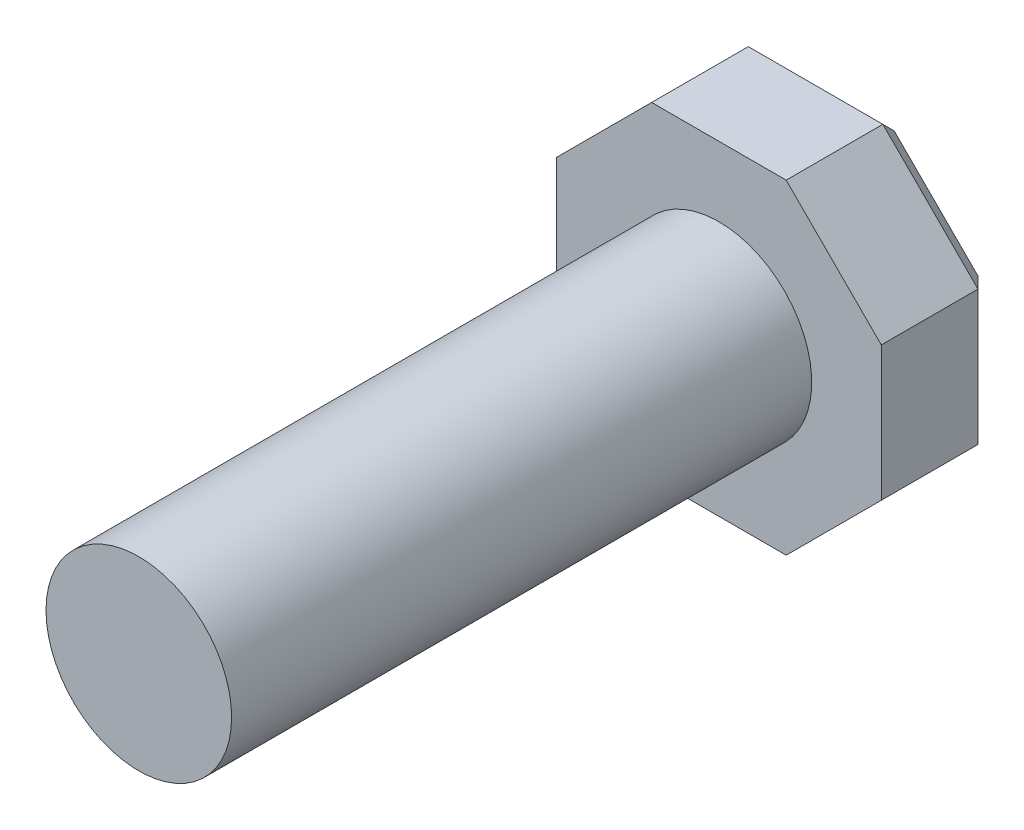
ISO-10303-21;
HEADER;
FILE_DESCRIPTION(('STEP AP214'),'2;1');
FILE_NAME('part.step','',(''),(''),'','','');
FILE_SCHEMA(('AUTOMOTIVE_DESIGN { 1 0 10303 214 1 1 1 1 }'));
ENDSEC;
DATA;
#1=APPLICATION_CONTEXT('core data for automotive mechanical design processes');
#2=APPLICATION_PROTOCOL_DEFINITION('international standard','automotive_design',2000,#1);
#3=PRODUCT_CONTEXT('',#1,'mechanical');
#4=PRODUCT('Part','Part','',(#3));
#5=PRODUCT_RELATED_PRODUCT_CATEGORY('part','',(#4));
#6=PRODUCT_DEFINITION_FORMATION('','',#4);
#7=PRODUCT_DEFINITION_CONTEXT('part definition',#1,'design');
#8=PRODUCT_DEFINITION('design','',#6,#7);
#9=PRODUCT_DEFINITION_SHAPE('','',#8);
#10=(LENGTH_UNIT() NAMED_UNIT(*) SI_UNIT(.MILLI.,.METRE.));
#11=(NAMED_UNIT(*) PLANE_ANGLE_UNIT() SI_UNIT($,.RADIAN.));
#12=(NAMED_UNIT(*) SI_UNIT($,.STERADIAN.) SOLID_ANGLE_UNIT());
#13=UNCERTAINTY_MEASURE_WITH_UNIT(LENGTH_MEASURE(1.E-05),#10,'distance_accuracy_value','');
#14=(GEOMETRIC_REPRESENTATION_CONTEXT(3) GLOBAL_UNCERTAINTY_ASSIGNED_CONTEXT((#13)) GLOBAL_UNIT_ASSIGNED_CONTEXT((#10,
#11,#12)) REPRESENTATION_CONTEXT('',''));
#15=CARTESIAN_POINT('',(0.,0.,0.));
#16=DIRECTION('',(0.,0.,1.));
#17=DIRECTION('',(1.,0.,0.));
#18=AXIS2_PLACEMENT_3D('',#15,#16,#17);
#19=CARTESIAN_POINT('',(21.0000000000007,20.9999999999999,14.9999999999998));
#20=DIRECTION('',(0.,0.,-1.));
#21=DIRECTION('',(-1.,0.,0.));
#22=AXIS2_PLACEMENT_3D('',#19,#20,#21);
#23=PLANE('',#22);
#24=DIRECTION('',(-1.,0.,0.));
#25=VECTOR('',#24,1.);
#26=CARTESIAN_POINT('',(-8.69848480983415,21.,14.9999999999998));
#27=LINE('',#26,#25);
#28=CARTESIAN_POINT('',(8.69848480983559,21.,14.9999999999998));
#29=VERTEX_POINT('',#28);
#30=CARTESIAN_POINT('',(-8.69848480983415,21.,14.9999999999998));
#31=VERTEX_POINT('',#30);
#32=EDGE_CURVE('E138',#29,#31,#27,.T.);
#33=ORIENTED_EDGE('',*,*,#32,.T.);
#34=DIRECTION('',(-0.707106781186544,-0.707106781186551,0.));
#35=VECTOR('',#34,1.);
#36=CARTESIAN_POINT('',(-20.9999999999991,8.69848480983493,15.0000000000002));
#37=LINE('',#36,#35);
#38=CARTESIAN_POINT('',(-20.9999999999991,8.69848480983493,15.0000000000002));
#39=VERTEX_POINT('',#38);
#40=EDGE_CURVE('E126',#31,#39,#37,.T.);
#41=ORIENTED_EDGE('',*,*,#40,.T.);
#42=DIRECTION('',(0.,-1.,0.));
#43=VECTOR('',#42,1.);
#44=CARTESIAN_POINT('',(-20.9999999999991,-8.69848480983509,15.0000000000002));
#45=LINE('',#44,#43);
#46=CARTESIAN_POINT('',(-20.9999999999991,-8.69848480983509,15.0000000000002));
#47=VERTEX_POINT('',#46);
#48=EDGE_CURVE('E137',#39,#47,#45,.T.);
#49=ORIENTED_EDGE('',*,*,#48,.T.);
#50=DIRECTION('',(0.707106781186549,-0.707106781186546,0.));
#51=VECTOR('',#50,1.);
#52=CARTESIAN_POINT('',(-8.69848480983504,-21.0000000000001,15.0000000000002));
#53=LINE('',#52,#51);
#54=CARTESIAN_POINT('',(-8.69848480983504,-21.0000000000001,15.0000000000002));
#55=VERTEX_POINT('',#54);
#56=EDGE_CURVE('E237',#47,#55,#53,.T.);
#57=ORIENTED_EDGE('',*,*,#56,.T.);
#58=DIRECTION('',(1.,0.,0.));
#59=VECTOR('',#58,1.);
#60=CARTESIAN_POINT('',(8.69848480983504,-21.,15.0000000000002));
#61=LINE('',#60,#59);
#62=CARTESIAN_POINT('',(8.69848480983504,-21.,15.0000000000002));
#63=VERTEX_POINT('',#62);
#64=EDGE_CURVE('E239',#55,#63,#61,.T.);
#65=ORIENTED_EDGE('',*,*,#64,.T.);
#66=DIRECTION('',(0.707106781186544,0.707106781186551,0.));
#67=VECTOR('',#66,1.);
#68=CARTESIAN_POINT('',(21.0000000000007,-8.69848480983496,14.9999999999998));
#69=LINE('',#68,#67);
#70=CARTESIAN_POINT('',(21.0000000000007,-8.69848480983496,14.9999999999998));
#71=VERTEX_POINT('',#70);
#72=EDGE_CURVE('E243',#63,#71,#69,.T.);
#73=ORIENTED_EDGE('',*,*,#72,.T.);
#74=DIRECTION('',(0.,1.,0.));
#75=VECTOR('',#74,1.);
#76=CARTESIAN_POINT('',(21.,8.69848480983507,14.9999999999998));
#77=LINE('',#76,#75);
#78=CARTESIAN_POINT('',(21.,8.69848480983507,14.9999999999998));
#79=VERTEX_POINT('',#78);
#80=EDGE_CURVE('E196',#71,#79,#77,.T.);
#81=ORIENTED_EDGE('',*,*,#80,.T.);
#82=DIRECTION('',(-0.707106781186548,0.707106781186546,0.));
#83=VECTOR('',#82,1.);
#84=CARTESIAN_POINT('',(8.69848480983559,21.,14.9999999999998));
#85=LINE('',#84,#83);
#86=EDGE_CURVE('E143',#79,#29,#85,.T.);
#87=ORIENTED_EDGE('',*,*,#86,.T.);
#88=EDGE_LOOP('',(#33,#41,#49,#57,#65,#73,#81,#87));
#89=FACE_BOUND('',#88,.T.);
#90=CARTESIAN_POINT('',(0.,0.,15.));
#91=DIRECTION('',(0.,0.,-1.));
#92=DIRECTION('',(-1.,0.,0.));
#93=AXIS2_PLACEMENT_3D('',#90,#91,#92);
#94=CIRCLE('',#93,12.);
#95=CARTESIAN_POINT('',(-12.,0.,15.));
#96=VERTEX_POINT('',#95);
#97=EDGE_CURVE('E11',#96,#96,#94,.F.);
#98=ORIENTED_EDGE('',*,*,#97,.F.);
#99=EDGE_LOOP('',(#98));
#100=FACE_BOUND('',#99,.T.);
#101=ADVANCED_FACE('F34',(#89,#100),#23,.F.);
#102=CARTESIAN_POINT('',(-8.69848480983415,21.,14.9999999999998));
#103=DIRECTION('',(0.,-1.,0.));
#104=DIRECTION('',(1.,0.,0.));
#105=AXIS2_PLACEMENT_3D('',#102,#103,#104);
#106=PLANE('',#105);
#107=DIRECTION('',(0.,0.,-1.));
#108=VECTOR('',#107,1.);
#109=CARTESIAN_POINT('',(8.69848480983559,21.,14.9999999999998));
#110=LINE('',#109,#108);
#111=CARTESIAN_POINT('',(8.69848480983504,21.,2.49999999999984));
#112=VERTEX_POINT('',#111);
#113=EDGE_CURVE('E247',#29,#112,#110,.T.);
#114=ORIENTED_EDGE('',*,*,#113,.T.);
#115=DIRECTION('',(-1.,0.,0.));
#116=VECTOR('',#115,1.);
#117=CARTESIAN_POINT('',(-8.69848480983415,21.,2.49999999999984));
#118=LINE('',#117,#116);
#119=CARTESIAN_POINT('',(-8.69848480983415,21.,2.49999999999984));
#120=VERTEX_POINT('',#119);
#121=EDGE_CURVE('E42',#112,#120,#118,.T.);
#122=ORIENTED_EDGE('',*,*,#121,.T.);
#123=DIRECTION('',(0.,0.,-1.));
#124=VECTOR('',#123,1.);
#125=CARTESIAN_POINT('',(-8.69848480983415,21.,14.9999999999998));
#126=LINE('',#125,#124);
#127=EDGE_CURVE('E131',#31,#120,#126,.T.);
#128=ORIENTED_EDGE('',*,*,#127,.F.);
#129=ORIENTED_EDGE('',*,*,#32,.F.);
#130=EDGE_LOOP('',(#114,#122,#128,#129));
#131=FACE_BOUND('',#130,.T.);
#132=ADVANCED_FACE('F36',(#131),#106,.F.);
#133=CARTESIAN_POINT('',(-20.9999999999991,8.69848480983493,15.0000000000002));
#134=DIRECTION('',(0.707106781186551,-0.707106781186544,0.));
#135=DIRECTION('',(0.707106781186544,0.707106781186551,0.));
#136=AXIS2_PLACEMENT_3D('',#133,#134,#135);
#137=PLANE('',#136);
#138=ORIENTED_EDGE('',*,*,#127,.T.);
#139=DIRECTION('',(-0.707106781186544,-0.707106781186551,0.));
#140=VECTOR('',#139,1.);
#141=CARTESIAN_POINT('',(-20.9999999999991,8.69848480983515,2.50000000000022));
#142=LINE('',#141,#140);
#143=CARTESIAN_POINT('',(-20.9999999999991,8.69848480983515,2.50000000000022));
#144=VERTEX_POINT('',#143);
#145=EDGE_CURVE('E148',#120,#144,#142,.T.);
#146=ORIENTED_EDGE('',*,*,#145,.T.);
#147=DIRECTION('',(0.,0.,-1.));
#148=VECTOR('',#147,1.);
#149=CARTESIAN_POINT('',(-20.9999999999991,8.69848480983493,15.0000000000002));
#150=LINE('',#149,#148);
#151=EDGE_CURVE('E134',#39,#144,#150,.T.);
#152=ORIENTED_EDGE('',*,*,#151,.F.);
#153=ORIENTED_EDGE('',*,*,#40,.F.);
#154=EDGE_LOOP('',(#138,#146,#152,#153));
#155=FACE_BOUND('',#154,.T.);
#156=ADVANCED_FACE('F128',(#155),#137,.F.);
#157=CARTESIAN_POINT('',(-20.9999999999991,-8.69848480983509,15.0000000000002));
#158=DIRECTION('',(1.,0.,0.));
#159=DIRECTION('',(0.,0.,-1.));
#160=AXIS2_PLACEMENT_3D('',#157,#158,#159);
#161=PLANE('',#160);
#162=ORIENTED_EDGE('',*,*,#151,.T.);
#163=DIRECTION('',(0.,-1.,0.));
#164=VECTOR('',#163,1.);
#165=CARTESIAN_POINT('',(-21.0000000000001,-8.69848480983487,2.50000000000022));
#166=LINE('',#165,#164);
#167=CARTESIAN_POINT('',(-21.0000000000001,-8.69848480983487,2.50000000000022));
#168=VERTEX_POINT('',#167);
#169=EDGE_CURVE('E172',#144,#168,#166,.T.);
#170=ORIENTED_EDGE('',*,*,#169,.T.);
#171=DIRECTION('',(0.,0.,-1.));
#172=VECTOR('',#171,1.);
#173=CARTESIAN_POINT('',(-20.9999999999991,-8.69848480983509,15.0000000000002));
#174=LINE('',#173,#172);
#175=EDGE_CURVE('E152',#47,#168,#174,.T.);
#176=ORIENTED_EDGE('',*,*,#175,.F.);
#177=ORIENTED_EDGE('',*,*,#48,.F.);
#178=EDGE_LOOP('',(#162,#170,#176,#177));
#179=FACE_BOUND('',#178,.T.);
#180=ADVANCED_FACE('F233',(#179),#161,.F.);
#181=CARTESIAN_POINT('',(-8.69848480983504,-21.0000000000001,15.0000000000002));
#182=DIRECTION('',(0.707106781186546,0.707106781186549,0.));
#183=DIRECTION('',(-0.707106781186549,0.707106781186546,0.));
#184=AXIS2_PLACEMENT_3D('',#181,#182,#183);
#185=PLANE('',#184);
#186=ORIENTED_EDGE('',*,*,#175,.T.);
#187=DIRECTION('',(0.707106781186549,-0.707106781186546,0.));
#188=VECTOR('',#187,1.);
#189=CARTESIAN_POINT('',(-8.69848480983526,-21.0000000000001,2.50000000000022));
#190=LINE('',#189,#188);
#191=CARTESIAN_POINT('',(-8.69848480983526,-21.0000000000001,2.50000000000022));
#192=VERTEX_POINT('',#191);
#193=EDGE_CURVE('E174',#168,#192,#190,.T.);
#194=ORIENTED_EDGE('',*,*,#193,.T.);
#195=DIRECTION('',(0.,0.,-1.));
#196=VECTOR('',#195,1.);
#197=CARTESIAN_POINT('',(-8.69848480983504,-21.0000000000001,15.0000000000002));
#198=LINE('',#197,#196);
#199=EDGE_CURVE('E251',#55,#192,#198,.T.);
#200=ORIENTED_EDGE('',*,*,#199,.F.);
#201=ORIENTED_EDGE('',*,*,#56,.F.);
#202=EDGE_LOOP('',(#186,#194,#200,#201));
#203=FACE_BOUND('',#202,.T.);
#204=ADVANCED_FACE('F255',(#203),#185,.F.);
#205=CARTESIAN_POINT('',(8.69848480983504,-21.,15.0000000000002));
#206=DIRECTION('',(0.,1.,0.));
#207=DIRECTION('',(-1.,0.,0.));
#208=AXIS2_PLACEMENT_3D('',#205,#206,#207);
#209=PLANE('',#208);
#210=ORIENTED_EDGE('',*,*,#199,.T.);
#211=DIRECTION('',(1.,0.,0.));
#212=VECTOR('',#211,1.);
#213=CARTESIAN_POINT('',(8.69848480983504,-21.,2.50000000000022));
#214=LINE('',#213,#212);
#215=CARTESIAN_POINT('',(8.69848480983504,-21.,2.50000000000022));
#216=VERTEX_POINT('',#215);
#217=EDGE_CURVE('E176',#192,#216,#214,.T.);
#218=ORIENTED_EDGE('',*,*,#217,.T.);
#219=DIRECTION('',(0.,0.,-1.));
#220=VECTOR('',#219,1.);
#221=CARTESIAN_POINT('',(8.69848480983504,-21.,15.0000000000002));
#222=LINE('',#221,#220);
#223=EDGE_CURVE('E190',#63,#216,#222,.T.);
#224=ORIENTED_EDGE('',*,*,#223,.F.);
#225=ORIENTED_EDGE('',*,*,#64,.F.);
#226=EDGE_LOOP('',(#210,#218,#224,#225));
#227=FACE_BOUND('',#226,.T.);
#228=ADVANCED_FACE('F304',(#227),#209,.F.);
#229=CARTESIAN_POINT('',(21.0000000000007,-8.69848480983496,14.9999999999998));
#230=DIRECTION('',(-0.707106781186551,0.707106781186544,0.));
#231=DIRECTION('',(-0.707106781186544,-0.707106781186551,0.));
#232=AXIS2_PLACEMENT_3D('',#229,#230,#231);
#233=PLANE('',#232);
#234=ORIENTED_EDGE('',*,*,#223,.T.);
#235=DIRECTION('',(0.707106781186544,0.707106781186551,0.));
#236=VECTOR('',#235,1.);
#237=CARTESIAN_POINT('',(21.,-8.69848480983518,2.49999999999984));
#238=LINE('',#237,#236);
#239=CARTESIAN_POINT('',(21.,-8.69848480983518,2.49999999999984));
#240=VERTEX_POINT('',#239);
#241=EDGE_CURVE('E178',#216,#240,#238,.T.);
#242=ORIENTED_EDGE('',*,*,#241,.T.);
#243=DIRECTION('',(0.,0.,-1.));
#244=VECTOR('',#243,1.);
#245=CARTESIAN_POINT('',(21.0000000000007,-8.69848480983496,14.9999999999998));
#246=LINE('',#245,#244);
#247=EDGE_CURVE('E187',#71,#240,#246,.T.);
#248=ORIENTED_EDGE('',*,*,#247,.F.);
#249=ORIENTED_EDGE('',*,*,#72,.F.);
#250=EDGE_LOOP('',(#234,#242,#248,#249));
#251=FACE_BOUND('',#250,.T.);
#252=ADVANCED_FACE('F185',(#251),#233,.F.);
#253=CARTESIAN_POINT('',(21.,8.69848480983507,14.9999999999998));
#254=DIRECTION('',(-1.,0.,0.));
#255=DIRECTION('',(0.,0.,1.));
#256=AXIS2_PLACEMENT_3D('',#253,#254,#255);
#257=PLANE('',#256);
#258=ORIENTED_EDGE('',*,*,#247,.T.);
#259=DIRECTION('',(0.,1.,0.));
#260=VECTOR('',#259,1.);
#261=CARTESIAN_POINT('',(21.,8.69848480983482,2.49999999999984));
#262=LINE('',#261,#260);
#263=CARTESIAN_POINT('',(21.,8.69848480983482,2.49999999999984));
#264=VERTEX_POINT('',#263);
#265=EDGE_CURVE('E57',#240,#264,#262,.T.);
#266=ORIENTED_EDGE('',*,*,#265,.T.);
#267=DIRECTION('',(0.,0.,-1.));
#268=VECTOR('',#267,1.);
#269=CARTESIAN_POINT('',(21.,8.69848480983507,14.9999999999998));
#270=LINE('',#269,#268);
#271=EDGE_CURVE('E197',#79,#264,#270,.T.);
#272=ORIENTED_EDGE('',*,*,#271,.F.);
#273=ORIENTED_EDGE('',*,*,#80,.F.);
#274=EDGE_LOOP('',(#258,#266,#272,#273));
#275=FACE_BOUND('',#274,.T.);
#276=ADVANCED_FACE('F195',(#275),#257,.F.);
#277=CARTESIAN_POINT('',(8.69848480983559,21.,14.9999999999998));
#278=DIRECTION('',(-0.707106781186546,-0.707106781186549,0.));
#279=DIRECTION('',(0.707106781186549,-0.707106781186546,0.));
#280=AXIS2_PLACEMENT_3D('',#277,#278,#279);
#281=PLANE('',#280);
#282=ORIENTED_EDGE('',*,*,#271,.T.);
#283=DIRECTION('',(-0.707106781186549,0.707106781186546,0.));
#284=VECTOR('',#283,1.);
#285=CARTESIAN_POINT('',(8.69848480983504,21.,2.49999999999984));
#286=LINE('',#285,#284);
#287=EDGE_CURVE('E49',#264,#112,#286,.T.);
#288=ORIENTED_EDGE('',*,*,#287,.T.);
#289=ORIENTED_EDGE('',*,*,#113,.F.);
#290=ORIENTED_EDGE('',*,*,#86,.F.);
#291=EDGE_LOOP('',(#282,#288,#289,#290));
#292=FACE_BOUND('',#291,.T.);
#293=ADVANCED_FACE('F297',(#292),#281,.F.);
#294=CARTESIAN_POINT('',(21.,21.0000000000001,-1.66533453693773E-13));
#295=DIRECTION('',(0.,0.,-1.));
#296=DIRECTION('',(-1.,0.,0.));
#297=AXIS2_PLACEMENT_3D('',#294,#295,#296);
#298=PLANE('',#297);
#299=DIRECTION('',(0.,1.,0.));
#300=VECTOR('',#299,1.);
#301=CARTESIAN_POINT('',(-18.4999999999992,8.69848480983493,2.22044604925031E-13));
#302=LINE('',#301,#300);
#303=CARTESIAN_POINT('',(-18.5000000000002,-7.66295090390234,2.22044604925031E-13));
#304=VERTEX_POINT('',#303);
#305=CARTESIAN_POINT('',(-18.4999999999992,7.66295090390218,2.22044604925031E-13));
#306=VERTEX_POINT('',#305);
#307=EDGE_CURVE('E167',#304,#306,#302,.T.);
#308=ORIENTED_EDGE('',*,*,#307,.T.);
#309=DIRECTION('',(0.707106781186544,0.707106781186551,0.));
#310=VECTOR('',#309,1.);
#311=CARTESIAN_POINT('',(-6.93071785686772,19.2322330470336,-1.66533453693773E-13));
#312=LINE('',#311,#310);
#313=CARTESIAN_POINT('',(-7.66295090390134,18.5,-1.66533453693773E-13));
#314=VERTEX_POINT('',#313);
#315=EDGE_CURVE('E169',#306,#314,#312,.T.);
#316=ORIENTED_EDGE('',*,*,#315,.T.);
#317=DIRECTION('',(1.,0.,0.));
#318=VECTOR('',#317,1.);
#319=CARTESIAN_POINT('',(8.69848480983504,18.5,-1.66533453693773E-13));
#320=LINE('',#319,#318);
#321=CARTESIAN_POINT('',(7.66295090390223,18.5,2.22044604925031E-13));
#322=VERTEX_POINT('',#321);
#323=EDGE_CURVE('E150',#314,#322,#320,.T.);
#324=ORIENTED_EDGE('',*,*,#323,.T.);
#325=DIRECTION('',(0.707106781186549,-0.707106781186546,0.));
#326=VECTOR('',#325,1.);
#327=CARTESIAN_POINT('',(19.2322330470337,6.93071785686866,-1.66533453693773E-13));
#328=LINE('',#327,#326);
#329=CARTESIAN_POINT('',(18.5000000000001,7.66295090390232,-1.66533453693773E-13));
#330=VERTEX_POINT('',#329);
#331=EDGE_CURVE('E157',#322,#330,#328,.T.);
#332=ORIENTED_EDGE('',*,*,#331,.T.);
#333=DIRECTION('',(0.,-1.,0.));
#334=VECTOR('',#333,1.);
#335=CARTESIAN_POINT('',(18.5000000000001,-8.69848480983496,-1.66533453693773E-13));
#336=LINE('',#335,#334);
#337=CARTESIAN_POINT('',(18.5000000000001,-7.66295090390223,-1.66533453693773E-13));
#338=VERTEX_POINT('',#337);
#339=EDGE_CURVE('E159',#330,#338,#336,.T.);
#340=ORIENTED_EDGE('',*,*,#339,.T.);
#341=DIRECTION('',(-0.707106781186544,-0.707106781186551,0.));
#342=VECTOR('',#341,1.);
#343=CARTESIAN_POINT('',(6.93071785686872,-19.2322330470336,2.22044604925031E-13));
#344=LINE('',#343,#342);
#345=CARTESIAN_POINT('',(7.66295090390234,-18.5,2.22044604925031E-13));
#346=VERTEX_POINT('',#345);
#347=EDGE_CURVE('E161',#338,#346,#344,.T.);
#348=ORIENTED_EDGE('',*,*,#347,.T.);
#349=DIRECTION('',(-1.,0.,0.));
#350=VECTOR('',#349,1.);
#351=CARTESIAN_POINT('',(-8.69848480983526,-18.5000000000001,2.22044604925031E-13));
#352=LINE('',#351,#350);
#353=CARTESIAN_POINT('',(-7.66295090390245,-18.5000000000001,-1.66533453693773E-13));
#354=VERTEX_POINT('',#353);
#355=EDGE_CURVE('E163',#346,#354,#352,.T.);
#356=ORIENTED_EDGE('',*,*,#355,.T.);
#357=DIRECTION('',(-0.707106781186549,0.707106781186546,0.));
#358=VECTOR('',#357,1.);
#359=CARTESIAN_POINT('',(-19.2322330470338,-6.93071785686872,2.22044604925031E-13));
#360=LINE('',#359,#358);
#361=EDGE_CURVE('E165',#354,#304,#360,.T.);
#362=ORIENTED_EDGE('',*,*,#361,.T.);
#363=EDGE_LOOP('',(#308,#316,#324,#332,#340,#348,#356,#362));
#364=FACE_BOUND('',#363,.T.);
#365=ADVANCED_FACE('F276',(#364),#298,.T.);
#366=CARTESIAN_POINT('',(21.,-8.69848480983518,2.49999999999984));
#367=DIRECTION('',(0.500000000000001,-0.499999999999996,-0.707106781186548));
#368=DIRECTION('',(-0.816496580927726,0.,-0.577350269189626));
#369=AXIS2_PLACEMENT_3D('',#366,#367,#368);
#370=PLANE('',#369);
#371=DIRECTION('',(-0.281084637714823,0.678598344545845,-0.678598344545842));
#372=VECTOR('',#371,1.);
#373=CARTESIAN_POINT('',(7.32397505593096,-17.6816399105106,-0.818360089489212));
#374=LINE('',#373,#372);
#375=EDGE_CURVE('E204',#346,#216,#374,.F.);
#376=ORIENTED_EDGE('',*,*,#375,.F.);
#377=ORIENTED_EDGE('',*,*,#347,.F.);
#378=DIRECTION('',(-0.678598344545849,0.281084637714819,-0.678598344545847));
#379=VECTOR('',#378,1.);
#380=CARTESIAN_POINT('',(17.6816399105106,-7.32397505593085,-0.818360089489573));
#381=LINE('',#380,#379);
#382=EDGE_CURVE('E145',#240,#338,#381,.T.);
#383=ORIENTED_EDGE('',*,*,#382,.F.);
#384=ORIENTED_EDGE('',*,*,#241,.F.);
#385=EDGE_LOOP('',(#376,#377,#383,#384));
#386=FACE_BOUND('',#385,.T.);
#387=ADVANCED_FACE('F201',(#386),#370,.T.);
#388=CARTESIAN_POINT('',(21.,8.69848480983482,2.49999999999984));
#389=DIRECTION('',(0.707106781186546,0.,-0.707106781186549));
#390=DIRECTION('',(-0.707106781186549,0.,-0.707106781186546));
#391=AXIS2_PLACEMENT_3D('',#388,#389,#390);
#392=PLANE('',#391);
#393=ORIENTED_EDGE('',*,*,#382,.T.);
#394=ORIENTED_EDGE('',*,*,#339,.F.);
#395=DIRECTION('',(-0.678598344545848,-0.281084637714821,-0.678598344545846));
#396=VECTOR('',#395,1.);
#397=CARTESIAN_POINT('',(17.6816399105106,7.32397505593094,-0.8183600894896));
#398=LINE('',#397,#396);
#399=EDGE_CURVE('E209',#264,#330,#398,.T.);
#400=ORIENTED_EDGE('',*,*,#399,.F.);
#401=ORIENTED_EDGE('',*,*,#265,.F.);
#402=EDGE_LOOP('',(#393,#394,#400,#401));
#403=FACE_BOUND('',#402,.T.);
#404=ADVANCED_FACE('F207',(#403),#392,.T.);
#405=CARTESIAN_POINT('',(8.69848480983504,-21.,2.50000000000022));
#406=DIRECTION('',(0.,-0.707106781186546,-0.707106781186549));
#407=DIRECTION('',(0.,0.707106781186549,-0.707106781186546));
#408=AXIS2_PLACEMENT_3D('',#405,#406,#407);
#409=PLANE('',#408);
#410=ORIENTED_EDGE('',*,*,#375,.T.);
#411=ORIENTED_EDGE('',*,*,#217,.F.);
#412=DIRECTION('',(0.28108463771482,0.678598344545849,-0.678598344545845));
#413=VECTOR('',#412,1.);
#414=CARTESIAN_POINT('',(-7.32397505593108,-17.6816399105106,-0.818360089489573));
#415=LINE('',#414,#413);
#416=EDGE_CURVE('E212',#354,#192,#415,.F.);
#417=ORIENTED_EDGE('',*,*,#416,.F.);
#418=ORIENTED_EDGE('',*,*,#355,.F.);
#419=EDGE_LOOP('',(#410,#411,#417,#418));
#420=FACE_BOUND('',#419,.T.);
#421=ADVANCED_FACE('F274',(#420),#409,.T.);
#422=CARTESIAN_POINT('',(8.69848480983504,21.,2.49999999999984));
#423=DIRECTION('',(0.499999999999998,0.5,-0.707106781186552));
#424=DIRECTION('',(0.,0.816496580927727,0.577350269189625));
#425=AXIS2_PLACEMENT_3D('',#422,#423,#424);
#426=PLANE('',#425);
#427=ORIENTED_EDGE('',*,*,#399,.T.);
#428=ORIENTED_EDGE('',*,*,#331,.F.);
#429=DIRECTION('',(-0.281084637714819,-0.678598344545852,-0.678598344545845));
#430=VECTOR('',#429,1.);
#431=CARTESIAN_POINT('',(7.32397505593085,17.6816399105106,-0.818360089489212));
#432=LINE('',#431,#430);
#433=EDGE_CURVE('E217',#112,#322,#432,.T.);
#434=ORIENTED_EDGE('',*,*,#433,.F.);
#435=ORIENTED_EDGE('',*,*,#287,.F.);
#436=EDGE_LOOP('',(#427,#428,#434,#435));
#437=FACE_BOUND('',#436,.T.);
#438=ADVANCED_FACE('F215',(#437),#426,.T.);
#439=CARTESIAN_POINT('',(-8.69848480983526,-21.0000000000001,2.50000000000022));
#440=DIRECTION('',(-0.499999999999998,-0.5,-0.707106781186546));
#441=DIRECTION('',(0.,0.816496580927727,-0.577350269189624));
#442=AXIS2_PLACEMENT_3D('',#439,#440,#441);
#443=PLANE('',#442);
#444=ORIENTED_EDGE('',*,*,#416,.T.);
#445=ORIENTED_EDGE('',*,*,#193,.F.);
#446=DIRECTION('',(0.678598344545848,0.281084637714823,-0.678598344545845));
#447=VECTOR('',#446,1.);
#448=CARTESIAN_POINT('',(-17.6816399105106,-7.32397505593096,-0.818360089489184));
#449=LINE('',#448,#447);
#450=EDGE_CURVE('E220',#304,#168,#449,.F.);
#451=ORIENTED_EDGE('',*,*,#450,.F.);
#452=ORIENTED_EDGE('',*,*,#361,.F.);
#453=EDGE_LOOP('',(#444,#445,#451,#452));
#454=FACE_BOUND('',#453,.T.);
#455=ADVANCED_FACE('F261',(#454),#443,.T.);
#456=CARTESIAN_POINT('',(-8.69848480983415,21.,2.49999999999984));
#457=DIRECTION('',(0.,0.707106781186546,-0.707106781186549));
#458=DIRECTION('',(0.,0.707106781186549,0.707106781186546));
#459=AXIS2_PLACEMENT_3D('',#456,#457,#458);
#460=PLANE('',#459);
#461=ORIENTED_EDGE('',*,*,#433,.T.);
#462=ORIENTED_EDGE('',*,*,#323,.F.);
#463=DIRECTION('',(-0.281084637714824,0.678598344545847,0.678598344545849));
#464=VECTOR('',#463,1.);
#465=CARTESIAN_POINT('',(-8.69848480983415,21.,2.49999999999984));
#466=LINE('',#465,#464);
#467=EDGE_CURVE('E223',#120,#314,#466,.F.);
#468=ORIENTED_EDGE('',*,*,#467,.F.);
#469=ORIENTED_EDGE('',*,*,#121,.F.);
#470=EDGE_LOOP('',(#461,#462,#468,#469));
#471=FACE_BOUND('',#470,.T.);
#472=ADVANCED_FACE('F222',(#471),#460,.T.);
#473=CARTESIAN_POINT('',(-21.0000000000001,-8.69848480983487,2.50000000000022));
#474=DIRECTION('',(-0.707106781186546,0.,-0.707106781186549));
#475=DIRECTION('',(-0.707106781186549,0.,0.707106781186546));
#476=AXIS2_PLACEMENT_3D('',#473,#474,#475);
#477=PLANE('',#476);
#478=ORIENTED_EDGE('',*,*,#450,.T.);
#479=ORIENTED_EDGE('',*,*,#169,.F.);
#480=DIRECTION('',(0.678598344545849,-0.281084637714819,-0.678598344545844));
#481=VECTOR('',#480,1.);
#482=CARTESIAN_POINT('',(-17.6816399105096,7.32397505593083,-0.818360089489184));
#483=LINE('',#482,#481);
#484=EDGE_CURVE('E227',#306,#144,#483,.F.);
#485=ORIENTED_EDGE('',*,*,#484,.F.);
#486=ORIENTED_EDGE('',*,*,#307,.F.);
#487=EDGE_LOOP('',(#478,#479,#485,#486));
#488=FACE_BOUND('',#487,.T.);
#489=ADVANCED_FACE('F266',(#488),#477,.T.);
#490=CARTESIAN_POINT('',(-20.9999999999991,8.69848480983515,2.50000000000022));
#491=DIRECTION('',(-0.500000000000001,0.499999999999996,-0.707106781186551));
#492=DIRECTION('',(-0.816496580927726,0.,0.577350269189626));
#493=AXIS2_PLACEMENT_3D('',#490,#491,#492);
#494=PLANE('',#493);
#495=ORIENTED_EDGE('',*,*,#467,.T.);
#496=ORIENTED_EDGE('',*,*,#315,.F.);
#497=ORIENTED_EDGE('',*,*,#484,.T.);
#498=ORIENTED_EDGE('',*,*,#145,.F.);
#499=EDGE_LOOP('',(#495,#496,#497,#498));
#500=FACE_BOUND('',#499,.T.);
#501=ADVANCED_FACE('F229',(#500),#494,.T.);
#502=CARTESIAN_POINT('',(0.,-1.66533453693773E-13,90.));
#503=DIRECTION('',(0.,0.,-1.));
#504=DIRECTION('',(-1.,0.,0.));
#505=AXIS2_PLACEMENT_3D('',#502,#503,#504);
#506=CYLINDRICAL_SURFACE('',#505,12.);
#507=CARTESIAN_POINT('',(0.,-1.66533453693773E-13,90.));
#508=DIRECTION('',(0.,0.,1.));
#509=DIRECTION('',(1.,0.,0.));
#510=AXIS2_PLACEMENT_3D('',#507,#508,#509);
#511=CIRCLE('',#510,12.);
#512=CARTESIAN_POINT('',(12.,-1.66533453693773E-13,90.));
#513=VERTEX_POINT('',#512);
#514=EDGE_CURVE('E277',#513,#513,#511,.T.);
#515=ORIENTED_EDGE('',*,*,#514,.F.);
#516=EDGE_LOOP('',(#515));
#517=FACE_BOUND('',#516,.T.);
#518=ORIENTED_EDGE('',*,*,#97,.T.);
#519=EDGE_LOOP('',(#518));
#520=FACE_BOUND('',#519,.T.);
#521=ADVANCED_FACE('F284',(#517,#520),#506,.T.);
#522=CARTESIAN_POINT('',(0.,-1.66533453693773E-13,90.));
#523=DIRECTION('',(0.,0.,1.));
#524=DIRECTION('',(1.,0.,0.));
#525=AXIS2_PLACEMENT_3D('',#522,#523,#524);
#526=PLANE('',#525);
#527=ORIENTED_EDGE('',*,*,#514,.T.);
#528=EDGE_LOOP('',(#527));
#529=FACE_BOUND('',#528,.T.);
#530=ADVANCED_FACE('F282',(#529),#526,.T.);
#531=CLOSED_SHELL('',(#101,#132,#156,#180,#204,#228,#252,#276,#293,#365,#387,#404,#421,#438,
#455,#472,#489,#501,#521,#530));
#532=MANIFOLD_SOLID_BREP('B2',#531);
#533=ADVANCED_BREP_SHAPE_REPRESENTATION('',(#18,#532),#14);
#534=SHAPE_DEFINITION_REPRESENTATION(#9,#533);
ENDSEC;
END-ISO-10303-21;
